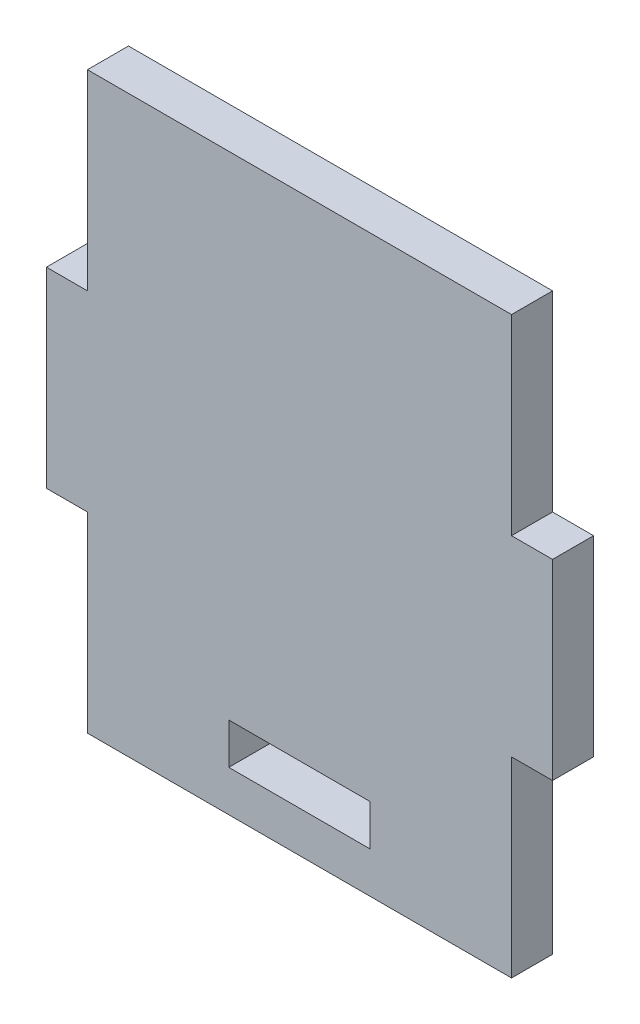
ISO-10303-21;
HEADER;
FILE_DESCRIPTION(('STEP AP214'),'2;1');
FILE_NAME('part.step','',(''),(''),'','','');
FILE_SCHEMA(('AUTOMOTIVE_DESIGN { 1 0 10303 214 1 1 1 1 }'));
ENDSEC;
DATA;
#1=APPLICATION_CONTEXT('core data for automotive mechanical design processes');
#2=APPLICATION_PROTOCOL_DEFINITION('international standard','automotive_design',2000,#1);
#3=PRODUCT_CONTEXT('',#1,'mechanical');
#4=PRODUCT('Part','Part','',(#3));
#5=PRODUCT_RELATED_PRODUCT_CATEGORY('part','',(#4));
#6=PRODUCT_DEFINITION_FORMATION('','',#4);
#7=PRODUCT_DEFINITION_CONTEXT('part definition',#1,'design');
#8=PRODUCT_DEFINITION('design','',#6,#7);
#9=PRODUCT_DEFINITION_SHAPE('','',#8);
#10=(LENGTH_UNIT() NAMED_UNIT(*) SI_UNIT(.MILLI.,.METRE.));
#11=(NAMED_UNIT(*) PLANE_ANGLE_UNIT() SI_UNIT($,.RADIAN.));
#12=(NAMED_UNIT(*) SI_UNIT($,.STERADIAN.) SOLID_ANGLE_UNIT());
#13=UNCERTAINTY_MEASURE_WITH_UNIT(LENGTH_MEASURE(1.E-05),#10,'distance_accuracy_value','');
#14=(GEOMETRIC_REPRESENTATION_CONTEXT(3) GLOBAL_UNCERTAINTY_ASSIGNED_CONTEXT((#13)) GLOBAL_UNIT_ASSIGNED_CONTEXT((#10,
#11,#12)) REPRESENTATION_CONTEXT('',''));
#15=CARTESIAN_POINT('',(0.,0.,0.));
#16=DIRECTION('',(0.,0.,1.));
#17=DIRECTION('',(1.,0.,0.));
#18=AXIS2_PLACEMENT_3D('',#15,#16,#17);
#19=CARTESIAN_POINT('',(0.,0.,3.));
#20=DIRECTION('',(0.,1.,0.));
#21=DIRECTION('',(0.,0.,1.));
#22=AXIS2_PLACEMENT_3D('',#19,#20,#21);
#23=PLANE('',#22);
#24=DIRECTION('',(1.,0.,0.));
#25=VECTOR('',#24,1.);
#26=CARTESIAN_POINT('',(0.,0.,0.));
#27=LINE('',#26,#25);
#28=CARTESIAN_POINT('',(0.,0.,0.));
#29=VERTEX_POINT('',#28);
#30=CARTESIAN_POINT('',(31.,0.,0.));
#31=VERTEX_POINT('',#30);
#32=EDGE_CURVE('E195',#29,#31,#27,.T.);
#33=ORIENTED_EDGE('',*,*,#32,.T.);
#34=DIRECTION('',(0.,0.,-1.));
#35=VECTOR('',#34,1.);
#36=CARTESIAN_POINT('',(31.,0.,3.));
#37=LINE('',#36,#35);
#38=CARTESIAN_POINT('',(31.,0.,3.));
#39=VERTEX_POINT('',#38);
#40=EDGE_CURVE('E11',#39,#31,#37,.T.);
#41=ORIENTED_EDGE('',*,*,#40,.F.);
#42=DIRECTION('',(1.,0.,0.));
#43=VECTOR('',#42,1.);
#44=CARTESIAN_POINT('',(0.,0.,3.));
#45=LINE('',#44,#43);
#46=CARTESIAN_POINT('',(0.,0.,3.));
#47=VERTEX_POINT('',#46);
#48=EDGE_CURVE('E263',#47,#39,#45,.T.);
#49=ORIENTED_EDGE('',*,*,#48,.F.);
#50=DIRECTION('',(0.,0.,-1.));
#51=VECTOR('',#50,1.);
#52=CARTESIAN_POINT('',(0.,0.,3.));
#53=LINE('',#52,#51);
#54=EDGE_CURVE('E219',#47,#29,#53,.T.);
#55=ORIENTED_EDGE('',*,*,#54,.T.);
#56=EDGE_LOOP('',(#33,#41,#49,#55));
#57=FACE_BOUND('',#56,.T.);
#58=ADVANCED_FACE('F35',(#57),#23,.F.);
#59=CARTESIAN_POINT('',(31.,0.,3.));
#60=DIRECTION('',(-1.,0.,0.));
#61=DIRECTION('',(0.,0.,1.));
#62=AXIS2_PLACEMENT_3D('',#59,#60,#61);
#63=PLANE('',#62);
#64=DIRECTION('',(0.,1.,0.));
#65=VECTOR('',#64,1.);
#66=CARTESIAN_POINT('',(31.,0.,0.));
#67=LINE('',#66,#65);
#68=CARTESIAN_POINT('',(31.,14.,0.));
#69=VERTEX_POINT('',#68);
#70=EDGE_CURVE('E198',#31,#69,#67,.T.);
#71=ORIENTED_EDGE('',*,*,#70,.T.);
#72=DIRECTION('',(0.,0.,-1.));
#73=VECTOR('',#72,1.);
#74=CARTESIAN_POINT('',(31.,14.,3.));
#75=LINE('',#74,#73);
#76=CARTESIAN_POINT('',(31.,14.,3.));
#77=VERTEX_POINT('',#76);
#78=EDGE_CURVE('E45',#77,#69,#75,.T.);
#79=ORIENTED_EDGE('',*,*,#78,.F.);
#80=DIRECTION('',(0.,1.,0.));
#81=VECTOR('',#80,1.);
#82=CARTESIAN_POINT('',(31.,0.,3.));
#83=LINE('',#82,#81);
#84=EDGE_CURVE('E266',#39,#77,#83,.T.);
#85=ORIENTED_EDGE('',*,*,#84,.F.);
#86=ORIENTED_EDGE('',*,*,#40,.T.);
#87=EDGE_LOOP('',(#71,#79,#85,#86));
#88=FACE_BOUND('',#87,.T.);
#89=ADVANCED_FACE('F305',(#88),#63,.F.);
#90=CARTESIAN_POINT('',(0.,14.,3.));
#91=DIRECTION('',(0.,1.,0.));
#92=DIRECTION('',(0.,0.,1.));
#93=AXIS2_PLACEMENT_3D('',#90,#91,#92);
#94=PLANE('',#93);
#95=DIRECTION('',(1.,0.,0.));
#96=VECTOR('',#95,1.);
#97=CARTESIAN_POINT('',(0.,14.,0.));
#98=LINE('',#97,#96);
#99=CARTESIAN_POINT('',(34.,14.,0.));
#100=VERTEX_POINT('',#99);
#101=EDGE_CURVE('E200',#69,#100,#98,.T.);
#102=ORIENTED_EDGE('',*,*,#101,.T.);
#103=DIRECTION('',(0.,0.,-1.));
#104=VECTOR('',#103,1.);
#105=CARTESIAN_POINT('',(34.,14.,3.));
#106=LINE('',#105,#104);
#107=CARTESIAN_POINT('',(34.,14.,3.));
#108=VERTEX_POINT('',#107);
#109=EDGE_CURVE('E234',#108,#100,#106,.T.);
#110=ORIENTED_EDGE('',*,*,#109,.F.);
#111=DIRECTION('',(1.,0.,0.));
#112=VECTOR('',#111,1.);
#113=CARTESIAN_POINT('',(0.,14.,3.));
#114=LINE('',#113,#112);
#115=EDGE_CURVE('E272',#77,#108,#114,.T.);
#116=ORIENTED_EDGE('',*,*,#115,.F.);
#117=ORIENTED_EDGE('',*,*,#78,.T.);
#118=EDGE_LOOP('',(#102,#110,#116,#117));
#119=FACE_BOUND('',#118,.T.);
#120=ADVANCED_FACE('F311',(#119),#94,.F.);
#121=CARTESIAN_POINT('',(34.,0.,3.));
#122=DIRECTION('',(1.,0.,0.));
#123=DIRECTION('',(0.,0.,-1.));
#124=AXIS2_PLACEMENT_3D('',#121,#122,#123);
#125=PLANE('',#124);
#126=DIRECTION('',(0.,-1.,0.));
#127=VECTOR('',#126,1.);
#128=CARTESIAN_POINT('',(34.,0.,0.));
#129=LINE('',#128,#127);
#130=CARTESIAN_POINT('',(34.,28.,0.));
#131=VERTEX_POINT('',#130);
#132=EDGE_CURVE('E204',#131,#100,#129,.T.);
#133=ORIENTED_EDGE('',*,*,#132,.F.);
#134=DIRECTION('',(0.,0.,-1.));
#135=VECTOR('',#134,1.);
#136=CARTESIAN_POINT('',(34.,28.,3.));
#137=LINE('',#136,#135);
#138=CARTESIAN_POINT('',(34.,28.,3.));
#139=VERTEX_POINT('',#138);
#140=EDGE_CURVE('E232',#139,#131,#137,.T.);
#141=ORIENTED_EDGE('',*,*,#140,.F.);
#142=DIRECTION('',(0.,-1.,0.));
#143=VECTOR('',#142,1.);
#144=CARTESIAN_POINT('',(34.,0.,3.));
#145=LINE('',#144,#143);
#146=EDGE_CURVE('E275',#139,#108,#145,.T.);
#147=ORIENTED_EDGE('',*,*,#146,.T.);
#148=ORIENTED_EDGE('',*,*,#109,.T.);
#149=EDGE_LOOP('',(#133,#141,#147,#148));
#150=FACE_BOUND('',#149,.T.);
#151=ADVANCED_FACE('F344',(#150),#125,.T.);
#152=CARTESIAN_POINT('',(0.,28.,3.));
#153=DIRECTION('',(0.,1.,0.));
#154=DIRECTION('',(0.,0.,1.));
#155=AXIS2_PLACEMENT_3D('',#152,#153,#154);
#156=PLANE('',#155);
#157=DIRECTION('',(1.,0.,0.));
#158=VECTOR('',#157,1.);
#159=CARTESIAN_POINT('',(0.,28.,0.));
#160=LINE('',#159,#158);
#161=CARTESIAN_POINT('',(31.,28.,0.));
#162=VERTEX_POINT('',#161);
#163=EDGE_CURVE('E207',#162,#131,#160,.T.);
#164=ORIENTED_EDGE('',*,*,#163,.F.);
#165=DIRECTION('',(0.,0.,-1.));
#166=VECTOR('',#165,1.);
#167=CARTESIAN_POINT('',(31.,28.,3.));
#168=LINE('',#167,#166);
#169=CARTESIAN_POINT('',(31.,28.,3.));
#170=VERTEX_POINT('',#169);
#171=EDGE_CURVE('E230',#170,#162,#168,.T.);
#172=ORIENTED_EDGE('',*,*,#171,.F.);
#173=DIRECTION('',(1.,0.,0.));
#174=VECTOR('',#173,1.);
#175=CARTESIAN_POINT('',(0.,28.,3.));
#176=LINE('',#175,#174);
#177=EDGE_CURVE('E278',#170,#139,#176,.T.);
#178=ORIENTED_EDGE('',*,*,#177,.T.);
#179=ORIENTED_EDGE('',*,*,#140,.T.);
#180=EDGE_LOOP('',(#164,#172,#178,#179));
#181=FACE_BOUND('',#180,.T.);
#182=ADVANCED_FACE('F341',(#181),#156,.T.);
#183=CARTESIAN_POINT('',(31.,42.,0.));
#184=VERTEX_POINT('',#183);
#185=EDGE_CURVE('E201',#162,#184,#67,.T.);
#186=ORIENTED_EDGE('',*,*,#185,.T.);
#187=DIRECTION('',(0.,0.,-1.));
#188=VECTOR('',#187,1.);
#189=CARTESIAN_POINT('',(31.,42.,3.));
#190=LINE('',#189,#188);
#191=CARTESIAN_POINT('',(31.,42.,3.));
#192=VERTEX_POINT('',#191);
#193=EDGE_CURVE('E228',#192,#184,#190,.T.);
#194=ORIENTED_EDGE('',*,*,#193,.F.);
#195=EDGE_CURVE('E273',#170,#192,#83,.T.);
#196=ORIENTED_EDGE('',*,*,#195,.F.);
#197=ORIENTED_EDGE('',*,*,#171,.T.);
#198=EDGE_LOOP('',(#186,#194,#196,#197));
#199=FACE_BOUND('',#198,.T.);
#200=ADVANCED_FACE('F314',(#199),#63,.F.);
#201=CARTESIAN_POINT('',(0.,42.,3.));
#202=DIRECTION('',(0.,1.,0.));
#203=DIRECTION('',(0.,0.,1.));
#204=AXIS2_PLACEMENT_3D('',#201,#202,#203);
#205=PLANE('',#204);
#206=DIRECTION('',(1.,0.,0.));
#207=VECTOR('',#206,1.);
#208=CARTESIAN_POINT('',(0.,42.,0.));
#209=LINE('',#208,#207);
#210=CARTESIAN_POINT('',(0.,42.,0.));
#211=VERTEX_POINT('',#210);
#212=EDGE_CURVE('E210',#211,#184,#209,.T.);
#213=ORIENTED_EDGE('',*,*,#212,.F.);
#214=DIRECTION('',(0.,0.,-1.));
#215=VECTOR('',#214,1.);
#216=CARTESIAN_POINT('',(0.,42.,3.));
#217=LINE('',#216,#215);
#218=CARTESIAN_POINT('',(0.,42.,3.));
#219=VERTEX_POINT('',#218);
#220=EDGE_CURVE('E226',#219,#211,#217,.T.);
#221=ORIENTED_EDGE('',*,*,#220,.F.);
#222=DIRECTION('',(1.,0.,0.));
#223=VECTOR('',#222,1.);
#224=CARTESIAN_POINT('',(0.,42.,3.));
#225=LINE('',#224,#223);
#226=EDGE_CURVE('E281',#219,#192,#225,.T.);
#227=ORIENTED_EDGE('',*,*,#226,.T.);
#228=ORIENTED_EDGE('',*,*,#193,.T.);
#229=EDGE_LOOP('',(#213,#221,#227,#228));
#230=FACE_BOUND('',#229,.T.);
#231=ADVANCED_FACE('F336',(#230),#205,.T.);
#232=CARTESIAN_POINT('',(0.,0.,3.));
#233=DIRECTION('',(1.,0.,0.));
#234=DIRECTION('',(0.,0.,-1.));
#235=AXIS2_PLACEMENT_3D('',#232,#233,#234);
#236=PLANE('',#235);
#237=DIRECTION('',(0.,-1.,0.));
#238=VECTOR('',#237,1.);
#239=CARTESIAN_POINT('',(0.,0.,0.));
#240=LINE('',#239,#238);
#241=CARTESIAN_POINT('',(0.,28.,0.));
#242=VERTEX_POINT('',#241);
#243=EDGE_CURVE('E213',#211,#242,#240,.T.);
#244=ORIENTED_EDGE('',*,*,#243,.T.);
#245=DIRECTION('',(0.,0.,-1.));
#246=VECTOR('',#245,1.);
#247=CARTESIAN_POINT('',(0.,28.,3.));
#248=LINE('',#247,#246);
#249=CARTESIAN_POINT('',(0.,28.,3.));
#250=VERTEX_POINT('',#249);
#251=EDGE_CURVE('E223',#250,#242,#248,.T.);
#252=ORIENTED_EDGE('',*,*,#251,.F.);
#253=DIRECTION('',(0.,-1.,0.));
#254=VECTOR('',#253,1.);
#255=CARTESIAN_POINT('',(0.,0.,3.));
#256=LINE('',#255,#254);
#257=EDGE_CURVE('E181',#219,#250,#256,.T.);
#258=ORIENTED_EDGE('',*,*,#257,.F.);
#259=ORIENTED_EDGE('',*,*,#220,.T.);
#260=EDGE_LOOP('',(#244,#252,#258,#259));
#261=FACE_BOUND('',#260,.T.);
#262=ADVANCED_FACE('F287',(#261),#236,.F.);
#263=CARTESIAN_POINT('',(0.,28.,3.));
#264=DIRECTION('',(0.,-1.,0.));
#265=DIRECTION('',(0.,0.,-1.));
#266=AXIS2_PLACEMENT_3D('',#263,#264,#265);
#267=PLANE('',#266);
#268=DIRECTION('',(-1.,0.,0.));
#269=VECTOR('',#268,1.);
#270=CARTESIAN_POINT('',(0.,28.,0.));
#271=LINE('',#270,#269);
#272=CARTESIAN_POINT('',(-3.,28.,0.));
#273=VERTEX_POINT('',#272);
#274=EDGE_CURVE('E215',#242,#273,#271,.T.);
#275=ORIENTED_EDGE('',*,*,#274,.T.);
#276=DIRECTION('',(0.,0.,-1.));
#277=VECTOR('',#276,1.);
#278=CARTESIAN_POINT('',(-3.,28.,3.));
#279=LINE('',#278,#277);
#280=CARTESIAN_POINT('',(-3.,28.,3.));
#281=VERTEX_POINT('',#280);
#282=EDGE_CURVE('E174',#281,#273,#279,.T.);
#283=ORIENTED_EDGE('',*,*,#282,.F.);
#284=DIRECTION('',(-1.,0.,0.));
#285=VECTOR('',#284,1.);
#286=CARTESIAN_POINT('',(0.,28.,3.));
#287=LINE('',#286,#285);
#288=EDGE_CURVE('E165',#250,#281,#287,.T.);
#289=ORIENTED_EDGE('',*,*,#288,.F.);
#290=ORIENTED_EDGE('',*,*,#251,.T.);
#291=EDGE_LOOP('',(#275,#283,#289,#290));
#292=FACE_BOUND('',#291,.T.);
#293=ADVANCED_FACE('F291',(#292),#267,.F.);
#294=CARTESIAN_POINT('',(-2.99999999999999,0.,3.));
#295=DIRECTION('',(1.,0.,0.));
#296=DIRECTION('',(0.,1.,0.));
#297=AXIS2_PLACEMENT_3D('',#294,#295,#296);
#298=PLANE('',#297);
#299=DIRECTION('',(0.,-1.,0.));
#300=VECTOR('',#299,1.);
#301=CARTESIAN_POINT('',(-2.99999999999999,0.,0.));
#302=LINE('',#301,#300);
#303=CARTESIAN_POINT('',(-3.,14.,0.));
#304=VERTEX_POINT('',#303);
#305=EDGE_CURVE('E173',#273,#304,#302,.T.);
#306=ORIENTED_EDGE('',*,*,#305,.T.);
#307=DIRECTION('',(0.,0.,-1.));
#308=VECTOR('',#307,1.);
#309=CARTESIAN_POINT('',(-3.,14.,3.));
#310=LINE('',#309,#308);
#311=CARTESIAN_POINT('',(-3.,14.,3.));
#312=VERTEX_POINT('',#311);
#313=EDGE_CURVE('E170',#312,#304,#310,.T.);
#314=ORIENTED_EDGE('',*,*,#313,.F.);
#315=DIRECTION('',(0.,-1.,0.));
#316=VECTOR('',#315,1.);
#317=CARTESIAN_POINT('',(-2.99999999999999,0.,3.));
#318=LINE('',#317,#316);
#319=EDGE_CURVE('E159',#281,#312,#318,.T.);
#320=ORIENTED_EDGE('',*,*,#319,.F.);
#321=ORIENTED_EDGE('',*,*,#282,.T.);
#322=EDGE_LOOP('',(#306,#314,#320,#321));
#323=FACE_BOUND('',#322,.T.);
#324=ADVANCED_FACE('F171',(#323),#298,.F.);
#325=CARTESIAN_POINT('',(0.,14.,3.));
#326=DIRECTION('',(0.,1.,0.));
#327=DIRECTION('',(0.,0.,1.));
#328=AXIS2_PLACEMENT_3D('',#325,#326,#327);
#329=PLANE('',#328);
#330=DIRECTION('',(1.,0.,0.));
#331=VECTOR('',#330,1.);
#332=CARTESIAN_POINT('',(0.,14.,0.));
#333=LINE('',#332,#331);
#334=CARTESIAN_POINT('',(0.,14.,0.));
#335=VERTEX_POINT('',#334);
#336=EDGE_CURVE('E107',#304,#335,#333,.T.);
#337=ORIENTED_EDGE('',*,*,#336,.T.);
#338=DIRECTION('',(0.,0.,-1.));
#339=VECTOR('',#338,1.);
#340=CARTESIAN_POINT('',(0.,14.,3.));
#341=LINE('',#340,#339);
#342=CARTESIAN_POINT('',(0.,14.,3.));
#343=VERTEX_POINT('',#342);
#344=EDGE_CURVE('E175',#343,#335,#341,.T.);
#345=ORIENTED_EDGE('',*,*,#344,.F.);
#346=DIRECTION('',(1.,0.,0.));
#347=VECTOR('',#346,1.);
#348=CARTESIAN_POINT('',(0.,14.,3.));
#349=LINE('',#348,#347);
#350=EDGE_CURVE('E163',#312,#343,#349,.T.);
#351=ORIENTED_EDGE('',*,*,#350,.F.);
#352=ORIENTED_EDGE('',*,*,#313,.T.);
#353=EDGE_LOOP('',(#337,#345,#351,#352));
#354=FACE_BOUND('',#353,.T.);
#355=ADVANCED_FACE('F177',(#354),#329,.F.);
#356=CARTESIAN_POINT('',(20.67,0.,3.));
#357=DIRECTION('',(-1.,0.,0.));
#358=DIRECTION('',(0.,0.,1.));
#359=AXIS2_PLACEMENT_3D('',#356,#357,#358);
#360=PLANE('',#359);
#361=DIRECTION('',(0.,1.,0.));
#362=VECTOR('',#361,1.);
#363=CARTESIAN_POINT('',(20.67,0.,0.));
#364=LINE('',#363,#362);
#365=CARTESIAN_POINT('',(20.67,3.,0.));
#366=VERTEX_POINT('',#365);
#367=CARTESIAN_POINT('',(20.67,6.,0.));
#368=VERTEX_POINT('',#367);
#369=EDGE_CURVE('E184',#366,#368,#364,.T.);
#370=ORIENTED_EDGE('',*,*,#369,.F.);
#371=DIRECTION('',(0.,0.,-1.));
#372=VECTOR('',#371,1.);
#373=CARTESIAN_POINT('',(20.67,3.,3.));
#374=LINE('',#373,#372);
#375=CARTESIAN_POINT('',(20.67,3.,3.));
#376=VERTEX_POINT('',#375);
#377=EDGE_CURVE('E39',#376,#366,#374,.T.);
#378=ORIENTED_EDGE('',*,*,#377,.F.);
#379=DIRECTION('',(0.,1.,0.));
#380=VECTOR('',#379,1.);
#381=CARTESIAN_POINT('',(20.67,0.,3.));
#382=LINE('',#381,#380);
#383=CARTESIAN_POINT('',(20.67,6.,3.));
#384=VERTEX_POINT('',#383);
#385=EDGE_CURVE('E293',#376,#384,#382,.T.);
#386=ORIENTED_EDGE('',*,*,#385,.T.);
#387=DIRECTION('',(0.,0.,-1.));
#388=VECTOR('',#387,1.);
#389=CARTESIAN_POINT('',(20.67,6.,3.));
#390=LINE('',#389,#388);
#391=EDGE_CURVE('E179',#384,#368,#390,.T.);
#392=ORIENTED_EDGE('',*,*,#391,.T.);
#393=EDGE_LOOP('',(#370,#378,#386,#392));
#394=FACE_BOUND('',#393,.T.);
#395=ADVANCED_FACE('F37',(#394),#360,.T.);
#396=CARTESIAN_POINT('',(0.,3.,3.));
#397=DIRECTION('',(0.,1.,0.));
#398=DIRECTION('',(0.,0.,1.));
#399=AXIS2_PLACEMENT_3D('',#396,#397,#398);
#400=PLANE('',#399);
#401=DIRECTION('',(1.,0.,0.));
#402=VECTOR('',#401,1.);
#403=CARTESIAN_POINT('',(0.,3.,0.));
#404=LINE('',#403,#402);
#405=CARTESIAN_POINT('',(10.33,3.,0.));
#406=VERTEX_POINT('',#405);
#407=EDGE_CURVE('E187',#406,#366,#404,.T.);
#408=ORIENTED_EDGE('',*,*,#407,.F.);
#409=DIRECTION('',(0.,0.,-1.));
#410=VECTOR('',#409,1.);
#411=CARTESIAN_POINT('',(10.33,3.,3.));
#412=LINE('',#411,#410);
#413=CARTESIAN_POINT('',(10.33,3.,3.));
#414=VERTEX_POINT('',#413);
#415=EDGE_CURVE('E241',#414,#406,#412,.T.);
#416=ORIENTED_EDGE('',*,*,#415,.F.);
#417=DIRECTION('',(1.,0.,0.));
#418=VECTOR('',#417,1.);
#419=CARTESIAN_POINT('',(0.,3.,3.));
#420=LINE('',#419,#418);
#421=EDGE_CURVE('E250',#414,#376,#420,.T.);
#422=ORIENTED_EDGE('',*,*,#421,.T.);
#423=ORIENTED_EDGE('',*,*,#377,.T.);
#424=EDGE_LOOP('',(#408,#416,#422,#423));
#425=FACE_BOUND('',#424,.T.);
#426=ADVANCED_FACE('F248',(#425),#400,.T.);
#427=CARTESIAN_POINT('',(10.33,0.,3.));
#428=DIRECTION('',(-1.,0.,0.));
#429=DIRECTION('',(0.,0.,1.));
#430=AXIS2_PLACEMENT_3D('',#427,#428,#429);
#431=PLANE('',#430);
#432=DIRECTION('',(0.,1.,0.));
#433=VECTOR('',#432,1.);
#434=CARTESIAN_POINT('',(10.33,0.,0.));
#435=LINE('',#434,#433);
#436=CARTESIAN_POINT('',(10.33,6.,0.));
#437=VERTEX_POINT('',#436);
#438=EDGE_CURVE('E190',#406,#437,#435,.T.);
#439=ORIENTED_EDGE('',*,*,#438,.T.);
#440=DIRECTION('',(0.,0.,-1.));
#441=VECTOR('',#440,1.);
#442=CARTESIAN_POINT('',(10.33,6.,3.));
#443=LINE('',#442,#441);
#444=CARTESIAN_POINT('',(10.33,6.,3.));
#445=VERTEX_POINT('',#444);
#446=EDGE_CURVE('E239',#445,#437,#443,.T.);
#447=ORIENTED_EDGE('',*,*,#446,.F.);
#448=DIRECTION('',(0.,1.,0.));
#449=VECTOR('',#448,1.);
#450=CARTESIAN_POINT('',(10.33,0.,3.));
#451=LINE('',#450,#449);
#452=EDGE_CURVE('E264',#414,#445,#451,.T.);
#453=ORIENTED_EDGE('',*,*,#452,.F.);
#454=ORIENTED_EDGE('',*,*,#415,.T.);
#455=EDGE_LOOP('',(#439,#447,#453,#454));
#456=FACE_BOUND('',#455,.T.);
#457=ADVANCED_FACE('F257',(#456),#431,.F.);
#458=CARTESIAN_POINT('',(0.,6.,3.));
#459=DIRECTION('',(0.,1.,0.));
#460=DIRECTION('',(0.,0.,1.));
#461=AXIS2_PLACEMENT_3D('',#458,#459,#460);
#462=PLANE('',#461);
#463=DIRECTION('',(1.,0.,0.));
#464=VECTOR('',#463,1.);
#465=CARTESIAN_POINT('',(0.,6.,0.));
#466=LINE('',#465,#464);
#467=EDGE_CURVE('E192',#437,#368,#466,.T.);
#468=ORIENTED_EDGE('',*,*,#467,.T.);
#469=ORIENTED_EDGE('',*,*,#391,.F.);
#470=DIRECTION('',(1.,0.,0.));
#471=VECTOR('',#470,1.);
#472=CARTESIAN_POINT('',(0.,6.,3.));
#473=LINE('',#472,#471);
#474=EDGE_CURVE('E261',#445,#384,#473,.T.);
#475=ORIENTED_EDGE('',*,*,#474,.F.);
#476=ORIENTED_EDGE('',*,*,#446,.T.);
#477=EDGE_LOOP('',(#468,#469,#475,#476));
#478=FACE_BOUND('',#477,.T.);
#479=ADVANCED_FACE('F260',(#478),#462,.F.);
#480=EDGE_CURVE('E113',#335,#29,#240,.T.);
#481=ORIENTED_EDGE('',*,*,#480,.T.);
#482=ORIENTED_EDGE('',*,*,#54,.F.);
#483=EDGE_CURVE('E54',#343,#47,#256,.T.);
#484=ORIENTED_EDGE('',*,*,#483,.F.);
#485=ORIENTED_EDGE('',*,*,#344,.T.);
#486=EDGE_LOOP('',(#481,#482,#484,#485));
#487=FACE_BOUND('',#486,.T.);
#488=ADVANCED_FACE('F296',(#487),#236,.F.);
#489=CARTESIAN_POINT('',(0.,0.,3.));
#490=DIRECTION('',(0.,0.,1.));
#491=DIRECTION('',(1.,0.,0.));
#492=AXIS2_PLACEMENT_3D('',#489,#490,#491);
#493=PLANE('',#492);
#494=ORIENTED_EDGE('',*,*,#385,.F.);
#495=ORIENTED_EDGE('',*,*,#421,.F.);
#496=ORIENTED_EDGE('',*,*,#452,.T.);
#497=ORIENTED_EDGE('',*,*,#474,.T.);
#498=EDGE_LOOP('',(#494,#495,#496,#497));
#499=FACE_BOUND('',#498,.T.);
#500=ORIENTED_EDGE('',*,*,#48,.T.);
#501=ORIENTED_EDGE('',*,*,#84,.T.);
#502=ORIENTED_EDGE('',*,*,#115,.T.);
#503=ORIENTED_EDGE('',*,*,#146,.F.);
#504=ORIENTED_EDGE('',*,*,#177,.F.);
#505=ORIENTED_EDGE('',*,*,#195,.T.);
#506=ORIENTED_EDGE('',*,*,#226,.F.);
#507=ORIENTED_EDGE('',*,*,#257,.T.);
#508=ORIENTED_EDGE('',*,*,#288,.T.);
#509=ORIENTED_EDGE('',*,*,#319,.T.);
#510=ORIENTED_EDGE('',*,*,#350,.T.);
#511=ORIENTED_EDGE('',*,*,#483,.T.);
#512=EDGE_LOOP('',(#500,#501,#502,#503,#504,#505,#506,#507,#508,#509,#510,#511));
#513=FACE_BOUND('',#512,.T.);
#514=ADVANCED_FACE('F161',(#499,#513),#493,.T.);
#515=CARTESIAN_POINT('',(0.,0.,0.));
#516=DIRECTION('',(0.,0.,1.));
#517=DIRECTION('',(1.,0.,0.));
#518=AXIS2_PLACEMENT_3D('',#515,#516,#517);
#519=PLANE('',#518);
#520=ORIENTED_EDGE('',*,*,#369,.T.);
#521=ORIENTED_EDGE('',*,*,#467,.F.);
#522=ORIENTED_EDGE('',*,*,#438,.F.);
#523=ORIENTED_EDGE('',*,*,#407,.T.);
#524=EDGE_LOOP('',(#520,#521,#522,#523));
#525=FACE_BOUND('',#524,.T.);
#526=ORIENTED_EDGE('',*,*,#32,.F.);
#527=ORIENTED_EDGE('',*,*,#480,.F.);
#528=ORIENTED_EDGE('',*,*,#336,.F.);
#529=ORIENTED_EDGE('',*,*,#305,.F.);
#530=ORIENTED_EDGE('',*,*,#274,.F.);
#531=ORIENTED_EDGE('',*,*,#243,.F.);
#532=ORIENTED_EDGE('',*,*,#212,.T.);
#533=ORIENTED_EDGE('',*,*,#185,.F.);
#534=ORIENTED_EDGE('',*,*,#163,.T.);
#535=ORIENTED_EDGE('',*,*,#132,.T.);
#536=ORIENTED_EDGE('',*,*,#101,.F.);
#537=ORIENTED_EDGE('',*,*,#70,.F.);
#538=EDGE_LOOP('',(#526,#527,#528,#529,#530,#531,#532,#533,#534,#535,#536,#537));
#539=FACE_BOUND('',#538,.T.);
#540=ADVANCED_FACE('F254',(#525,#539),#519,.F.);
#541=CLOSED_SHELL('',(#58,#89,#120,#151,#182,#200,#231,#262,#293,#324,#355,#395,#426,#457,#479,
#488,#514,#540));
#542=MANIFOLD_SOLID_BREP('B2',#541);
#543=ADVANCED_BREP_SHAPE_REPRESENTATION('',(#18,#542),#14);
#544=SHAPE_DEFINITION_REPRESENTATION(#9,#543);
ENDSEC;
END-ISO-10303-21;
